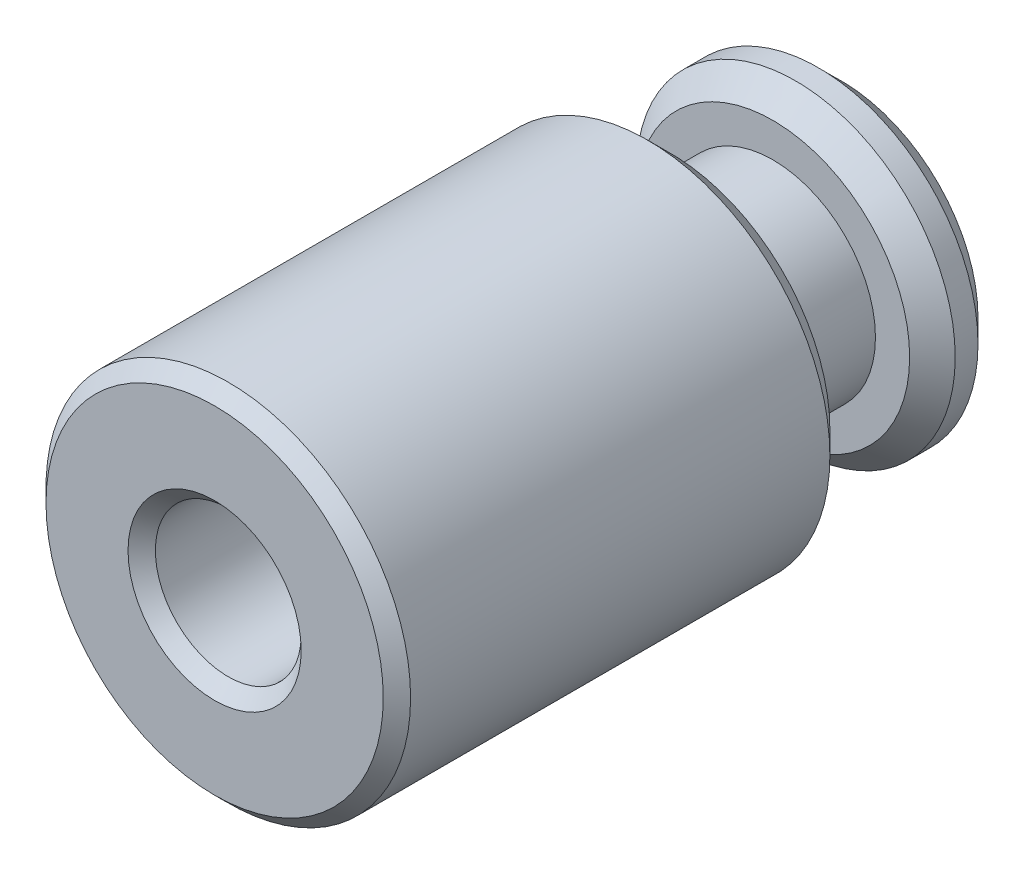
ISO-10303-21;
HEADER;
FILE_DESCRIPTION(('STEP AP214'),'2;1');
FILE_NAME('part.step','',(''),(''),'','','');
FILE_SCHEMA(('AUTOMOTIVE_DESIGN { 1 0 10303 214 1 1 1 1 }'));
ENDSEC;
DATA;
#1=APPLICATION_CONTEXT('core data for automotive mechanical design processes');
#2=APPLICATION_PROTOCOL_DEFINITION('international standard','automotive_design',2000,#1);
#3=PRODUCT_CONTEXT('',#1,'mechanical');
#4=PRODUCT('Part','Part','',(#3));
#5=PRODUCT_RELATED_PRODUCT_CATEGORY('part','',(#4));
#6=PRODUCT_DEFINITION_FORMATION('','',#4);
#7=PRODUCT_DEFINITION_CONTEXT('part definition',#1,'design');
#8=PRODUCT_DEFINITION('design','',#6,#7);
#9=PRODUCT_DEFINITION_SHAPE('','',#8);
#10=(LENGTH_UNIT() NAMED_UNIT(*) SI_UNIT(.MILLI.,.METRE.));
#11=(NAMED_UNIT(*) PLANE_ANGLE_UNIT() SI_UNIT($,.RADIAN.));
#12=(NAMED_UNIT(*) SI_UNIT($,.STERADIAN.) SOLID_ANGLE_UNIT());
#13=UNCERTAINTY_MEASURE_WITH_UNIT(LENGTH_MEASURE(1.E-05),#10,'distance_accuracy_value','');
#14=(GEOMETRIC_REPRESENTATION_CONTEXT(3) GLOBAL_UNCERTAINTY_ASSIGNED_CONTEXT((#13)) GLOBAL_UNIT_ASSIGNED_CONTEXT((#10,
#11,#12)) REPRESENTATION_CONTEXT('',''));
#15=CARTESIAN_POINT('',(0.,0.,0.));
#16=DIRECTION('',(0.,0.,1.));
#17=DIRECTION('',(1.,0.,0.));
#18=AXIS2_PLACEMENT_3D('',#15,#16,#17);
#19=CARTESIAN_POINT('',(-1.192092889E-07,0.0006803143114548,-55.64877051889));
#20=DIRECTION('',(0.,-1.68587396411497E-07,-0.999999999999986));
#21=DIRECTION('',(0.,-0.999999999999986,1.68587396411497E-07));
#22=AXIS2_PLACEMENT_3D('',#19,#20,#21);
#23=PLANE('',#22);
#24=CARTESIAN_POINT('',(-1.192092887E-07,0.0006803143114543,-55.64877051889));
#25=DIRECTION('',(0.,-1.68587396641497E-07,-0.999999999999986));
#26=DIRECTION('',(1.,0.,0.));
#27=AXIS2_PLACEMENT_3D('',#24,#25,#26);
#28=CIRCLE('',#27,3.);
#29=CARTESIAN_POINT('',(2.999999880791,0.0006803143114549,-55.64877051889));
#30=VERTEX_POINT('',#29);
#31=EDGE_CURVE('E10',#30,#30,#28,.T.);
#32=ORIENTED_EDGE('',*,*,#31,.T.);
#33=EDGE_LOOP('',(#32));
#34=FACE_BOUND('',#33,.T.);
#35=ADVANCED_FACE('F15',(#34),#23,.T.);
#36=CARTESIAN_POINT('',(-1.192092887E-07,0.0006803986051527,-55.14877051889));
#37=DIRECTION('',(0.,1.68587396641497E-07,0.999999999999986));
#38=DIRECTION('',(1.,0.,0.));
#39=AXIS2_PLACEMENT_3D('',#36,#37,#38);
#40=CONICAL_SURFACE('',#39,3.5,0.785398163397);
#41=DIRECTION('',(-0.707106781186543,-1.19209291372723E-07,-0.707106781186543));
#42=VECTOR('',#41,1.);
#43=CARTESIAN_POINT('',(3.499999880791,0.0006803986051526,-55.14877051889));
#44=LINE('',#43,#42);
#45=CARTESIAN_POINT('',(3.499999880791,0.0006803986051534,-55.14877051889));
#46=VERTEX_POINT('',#45);
#47=EDGE_CURVE('E24',#46,#30,#44,.T.);
#48=ORIENTED_EDGE('',*,*,#47,.F.);
#49=CARTESIAN_POINT('',(-1.192092887E-07,0.0006803986051527,-55.14877051889));
#50=DIRECTION('',(0.,-1.68587396641497E-07,-0.999999999999986));
#51=DIRECTION('',(1.,0.,0.));
#52=AXIS2_PLACEMENT_3D('',#49,#50,#51);
#53=CIRCLE('',#52,3.5);
#54=EDGE_CURVE('E127',#46,#46,#53,.T.);
#55=ORIENTED_EDGE('',*,*,#54,.T.);
#56=ORIENTED_EDGE('',*,*,#47,.T.);
#57=ORIENTED_EDGE('',*,*,#31,.F.);
#58=EDGE_LOOP('',(#48,#55,#56,#57));
#59=FACE_BOUND('',#58,.T.);
#60=ADVANCED_FACE('F17',(#59),#40,.T.);
#61=CARTESIAN_POINT('',(-1.192092887E-07,0.0006805671925493,-54.14877051889));
#62=DIRECTION('',(0.,1.68587396711497E-07,0.999999999999986));
#63=DIRECTION('',(1.,0.,0.));
#64=AXIS2_PLACEMENT_3D('',#61,#62,#63);
#65=CYLINDRICAL_SURFACE('',#64,3.5);
#66=CARTESIAN_POINT('',(-1.192092887E-07,0.000680482898851,-54.64877051889));
#67=DIRECTION('',(0.,-1.68587396641497E-07,-0.999999999999986));
#68=DIRECTION('',(1.,0.,0.));
#69=AXIS2_PLACEMENT_3D('',#66,#67,#68);
#70=CIRCLE('',#69,3.5);
#71=CARTESIAN_POINT('',(3.499999880791,0.0006804828988518,-54.64877051889));
#72=VERTEX_POINT('',#71);
#73=EDGE_CURVE('E119',#72,#72,#70,.T.);
#74=ORIENTED_EDGE('',*,*,#73,.T.);
#75=DIRECTION('',(0.,-1.68587396711497E-07,-0.999999999999986));
#76=VECTOR('',#75,1.);
#77=CARTESIAN_POINT('',(3.499999880791,0.0006805671925493,-54.14877051889));
#78=LINE('',#77,#76);
#79=EDGE_CURVE('E123',#72,#46,#78,.T.);
#80=ORIENTED_EDGE('',*,*,#79,.T.);
#81=ORIENTED_EDGE('',*,*,#54,.F.);
#82=ORIENTED_EDGE('',*,*,#79,.F.);
#83=EDGE_LOOP('',(#74,#80,#81,#82));
#84=FACE_BOUND('',#83,.T.);
#85=ADVANCED_FACE('F133',(#84),#65,.T.);
#86=CARTESIAN_POINT('',(-1.192092887E-07,0.000680482898851,-54.64877051889));
#87=DIRECTION('',(0.,-1.68587396641497E-07,-0.999999999999986));
#88=DIRECTION('',(1.,0.,0.));
#89=AXIS2_PLACEMENT_3D('',#86,#87,#88);
#90=CONICAL_SURFACE('',#89,3.5,0.785398163397);
#91=DIRECTION('',(0.707106781186543,-1.19209291382723E-07,-0.707106781186543));
#92=VECTOR('',#91,1.);
#93=CARTESIAN_POINT('',(3.499999880791,0.000680482898851,-54.64877051889));
#94=LINE('',#93,#92);
#95=CARTESIAN_POINT('',(2.999999880791,0.0006805671925493,-54.14877051889));
#96=VERTEX_POINT('',#95);
#97=EDGE_CURVE('E118',#96,#72,#94,.T.);
#98=ORIENTED_EDGE('',*,*,#97,.F.);
#99=CARTESIAN_POINT('',(-1.192092887E-07,0.0006805671925493,-54.14877051889));
#100=DIRECTION('',(0.,-1.68587396641497E-07,-0.999999999999986));
#101=DIRECTION('',(1.,0.,0.));
#102=AXIS2_PLACEMENT_3D('',#99,#100,#101);
#103=CIRCLE('',#102,3.);
#104=EDGE_CURVE('E114',#96,#96,#103,.T.);
#105=ORIENTED_EDGE('',*,*,#104,.T.);
#106=ORIENTED_EDGE('',*,*,#97,.T.);
#107=ORIENTED_EDGE('',*,*,#73,.F.);
#108=EDGE_LOOP('',(#98,#105,#106,#107));
#109=FACE_BOUND('',#108,.T.);
#110=ADVANCED_FACE('F137',(#109),#90,.T.);
#111=CARTESIAN_POINT('',(-1.192092889E-07,0.0006805671925496,-54.14877051889));
#112=DIRECTION('',(0.,-1.68587396411497E-07,-0.999999999999986));
#113=DIRECTION('',(0.,-0.999999999999986,1.68587396411497E-07));
#114=AXIS2_PLACEMENT_3D('',#111,#112,#113);
#115=PLANE('',#114);
#116=CARTESIAN_POINT('',(-1.192092887E-07,0.0006805671925497,-54.14877051889));
#117=DIRECTION('',(0.,1.68587396711497E-07,0.999999999999986));
#118=DIRECTION('',(1.,0.,0.));
#119=AXIS2_PLACEMENT_3D('',#116,#117,#118);
#120=CIRCLE('',#119,2.25);
#121=CARTESIAN_POINT('',(2.249999880791,0.0006805671925493,-54.14877051889));
#122=VERTEX_POINT('',#121);
#123=EDGE_CURVE('E111',#122,#122,#120,.T.);
#124=ORIENTED_EDGE('',*,*,#123,.F.);
#125=EDGE_LOOP('',(#124));
#126=FACE_BOUND('',#125,.T.);
#127=ORIENTED_EDGE('',*,*,#104,.F.);
#128=EDGE_LOOP('',(#127));
#129=FACE_BOUND('',#128,.T.);
#130=ADVANCED_FACE('F226',(#126,#129),#115,.F.);
#131=CARTESIAN_POINT('',(-1.192092887E-07,0.0006809465141924,-51.89877051889));
#132=DIRECTION('',(0.,1.68587397151498E-07,0.999999999999986));
#133=DIRECTION('',(1.,0.,0.));
#134=AXIS2_PLACEMENT_3D('',#131,#132,#133);
#135=CYLINDRICAL_SURFACE('',#134,2.25);
#136=DIRECTION('',(0.,-1.68587397151498E-07,-0.999999999999986));
#137=VECTOR('',#136,1.);
#138=CARTESIAN_POINT('',(2.249999880791,0.0006809465141924,-51.89877051889));
#139=LINE('',#138,#137);
#140=CARTESIAN_POINT('',(2.249999880791,0.0006809465141924,-51.89877051889));
#141=VERTEX_POINT('',#140);
#142=EDGE_CURVE('E105',#141,#122,#139,.T.);
#143=ORIENTED_EDGE('',*,*,#142,.T.);
#144=ORIENTED_EDGE('',*,*,#123,.T.);
#145=ORIENTED_EDGE('',*,*,#142,.F.);
#146=CARTESIAN_POINT('',(-1.192092887E-07,0.0006809465141924,-51.89877051889));
#147=DIRECTION('',(0.,1.68587396711497E-07,0.999999999999986));
#148=DIRECTION('',(1.,0.,0.));
#149=AXIS2_PLACEMENT_3D('',#146,#147,#148);
#150=CIRCLE('',#149,2.25);
#151=EDGE_CURVE('E99',#141,#141,#150,.T.);
#152=ORIENTED_EDGE('',*,*,#151,.F.);
#153=EDGE_LOOP('',(#143,#144,#145,#152));
#154=FACE_BOUND('',#153,.T.);
#155=ADVANCED_FACE('F233',(#154),#135,.T.);
#156=CARTESIAN_POINT('',(-1.1920928896E-07,0.0006809465141927,-51.89877051889));
#157=DIRECTION('',(0.,-1.68587396711497E-07,-0.999999999999986));
#158=DIRECTION('',(0.,-0.999999999999986,1.68587396711497E-07));
#159=AXIS2_PLACEMENT_3D('',#156,#157,#158);
#160=PLANE('',#159);
#161=ORIENTED_EDGE('',*,*,#151,.T.);
#162=EDGE_LOOP('',(#161));
#163=FACE_BOUND('',#162,.T.);
#164=CARTESIAN_POINT('',(-1.192092887E-07,0.0006809465141924,-51.89877051889));
#165=DIRECTION('',(0.,1.68587396931497E-07,0.999999999999986));
#166=DIRECTION('',(1.,0.,0.));
#167=AXIS2_PLACEMENT_3D('',#164,#165,#166);
#168=CIRCLE('',#167,3.5);
#169=CARTESIAN_POINT('',(3.499999880791,0.0006809465141924,-51.89877051889));
#170=VERTEX_POINT('',#169);
#171=EDGE_CURVE('E94',#170,#170,#168,.T.);
#172=ORIENTED_EDGE('',*,*,#171,.F.);
#173=EDGE_LOOP('',(#172));
#174=FACE_BOUND('',#173,.T.);
#175=ADVANCED_FACE('F298',(#163,#174),#160,.T.);
#176=CARTESIAN_POINT('',(-1.192092887E-07,0.0006810308078909,-51.39877051889));
#177=DIRECTION('',(0.,1.68587396931497E-07,0.999999999999986));
#178=DIRECTION('',(1.,0.,0.));
#179=AXIS2_PLACEMENT_3D('',#176,#177,#178);
#180=CONICAL_SURFACE('',#179,4.,0.785398163397);
#181=ORIENTED_EDGE('',*,*,#171,.T.);
#182=DIRECTION('',(-0.707106781186543,-1.19209291592723E-07,-0.707106781186543));
#183=VECTOR('',#182,1.);
#184=CARTESIAN_POINT('',(3.999999880791,0.0006810308078909,-51.39877051889));
#185=LINE('',#184,#183);
#186=CARTESIAN_POINT('',(3.999999880791,0.0006810308078909,-51.39877051889));
#187=VERTEX_POINT('',#186);
#188=EDGE_CURVE('E91',#187,#170,#185,.T.);
#189=ORIENTED_EDGE('',*,*,#188,.F.);
#190=CARTESIAN_POINT('',(-1.192092887E-07,0.0006810308078909,-51.39877051889));
#191=DIRECTION('',(0.,1.68587396931497E-07,0.999999999999986));
#192=DIRECTION('',(1.,0.,0.));
#193=AXIS2_PLACEMENT_3D('',#190,#191,#192);
#194=CIRCLE('',#193,4.);
#195=EDGE_CURVE('E96',#187,#187,#194,.T.);
#196=ORIENTED_EDGE('',*,*,#195,.F.);
#197=ORIENTED_EDGE('',*,*,#188,.T.);
#198=EDGE_LOOP('',(#181,#189,#196,#197));
#199=FACE_BOUND('',#198,.T.);
#200=ADVANCED_FACE('F92',(#199),#180,.T.);
#201=CARTESIAN_POINT('',(-1.192092887E-07,0.0006809465141924,-51.89877051889));
#202=DIRECTION('',(0.,-1.68587397151498E-07,-0.999999999999986));
#203=DIRECTION('',(1.,0.,0.));
#204=AXIS2_PLACEMENT_3D('',#201,#202,#203);
#205=CYLINDRICAL_SURFACE('',#204,4.);
#206=ORIENTED_EDGE('',*,*,#195,.T.);
#207=DIRECTION('',(0.,1.68587397151498E-07,0.999999999999986));
#208=VECTOR('',#207,1.);
#209=CARTESIAN_POINT('',(3.999999880791,0.0006809465141924,-51.89877051889));
#210=LINE('',#209,#208);
#211=CARTESIAN_POINT('',(3.999999880791,0.0006825818119426,-42.19877051889));
#212=VERTEX_POINT('',#211);
#213=EDGE_CURVE('E107',#187,#212,#210,.T.);
#214=ORIENTED_EDGE('',*,*,#213,.T.);
#215=CARTESIAN_POINT('',(-1.192092887E-07,0.0006825818119426,-42.19877051889));
#216=DIRECTION('',(0.,1.68587396931497E-07,0.999999999999986));
#217=DIRECTION('',(1.,0.,0.));
#218=AXIS2_PLACEMENT_3D('',#215,#216,#217);
#219=CIRCLE('',#218,4.);
#220=EDGE_CURVE('E148',#212,#212,#219,.T.);
#221=ORIENTED_EDGE('',*,*,#220,.F.);
#222=ORIENTED_EDGE('',*,*,#213,.F.);
#223=EDGE_LOOP('',(#206,#214,#221,#222));
#224=FACE_BOUND('',#223,.T.);
#225=ADVANCED_FACE('F211',(#224),#205,.T.);
#226=CARTESIAN_POINT('',(-1.192092887E-07,0.0006825818119426,-42.19877051889));
#227=DIRECTION('',(0.,-1.68587396931497E-07,-0.999999999999986));
#228=DIRECTION('',(1.,0.,0.));
#229=AXIS2_PLACEMENT_3D('',#226,#227,#228);
#230=CONICAL_SURFACE('',#229,4.,0.785398163397);
#231=DIRECTION('',(-0.707106781186543,1.19209291212723E-07,0.707106781186543));
#232=VECTOR('',#231,1.);
#233=CARTESIAN_POINT('',(3.999999880791,0.0006825818119448,-42.19877051889));
#234=LINE('',#233,#232);
#235=CARTESIAN_POINT('',(3.699999880791,0.0006826323881617,-41.89877051889));
#236=VERTEX_POINT('',#235);
#237=EDGE_CURVE('E151',#212,#236,#234,.T.);
#238=ORIENTED_EDGE('',*,*,#237,.F.);
#239=ORIENTED_EDGE('',*,*,#220,.T.);
#240=ORIENTED_EDGE('',*,*,#237,.T.);
#241=CARTESIAN_POINT('',(-1.192092887E-07,0.0006826323881617,-41.89877051889));
#242=DIRECTION('',(0.,1.68587396931497E-07,0.999999999999986));
#243=DIRECTION('',(1.,0.,0.));
#244=AXIS2_PLACEMENT_3D('',#241,#242,#243);
#245=CIRCLE('',#244,3.7);
#246=EDGE_CURVE('E159',#236,#236,#245,.T.);
#247=ORIENTED_EDGE('',*,*,#246,.F.);
#248=EDGE_LOOP('',(#238,#239,#240,#247));
#249=FACE_BOUND('',#248,.T.);
#250=ADVANCED_FACE('F208',(#249),#230,.T.);
#251=CARTESIAN_POINT('',(-1.1920928896E-07,0.0006826323881617,-41.89877051889));
#252=DIRECTION('',(0.,-1.68587396711497E-07,-0.999999999999986));
#253=DIRECTION('',(0.,-0.999999999999986,1.68587396711497E-07));
#254=AXIS2_PLACEMENT_3D('',#251,#252,#253);
#255=PLANE('',#254);
#256=CARTESIAN_POINT('',(-1.192092887E-07,0.0006826323881617,-41.89877051889));
#257=DIRECTION('',(0.,1.68587396931497E-07,0.999999999999986));
#258=DIRECTION('',(1.,0.,0.));
#259=AXIS2_PLACEMENT_3D('',#256,#257,#258);
#260=CIRCLE('',#259,1.9);
#261=CARTESIAN_POINT('',(1.899999880791,0.0006826323881597,-41.89877051889));
#262=VERTEX_POINT('',#261);
#263=EDGE_CURVE('E146',#262,#262,#260,.T.);
#264=ORIENTED_EDGE('',*,*,#263,.F.);
#265=EDGE_LOOP('',(#264));
#266=FACE_BOUND('',#265,.T.);
#267=ORIENTED_EDGE('',*,*,#246,.T.);
#268=EDGE_LOOP('',(#267));
#269=FACE_BOUND('',#268,.T.);
#270=ADVANCED_FACE('F204',(#266,#269),#255,.F.);
#271=CARTESIAN_POINT('',(-1.1920928881E-07,0.0006812836889845,-49.89877051889));
#272=DIRECTION('',(0.,-1.68587396711497E-07,-0.999999999999986));
#273=DIRECTION('',(0.,-0.999999999999986,1.68587396711497E-07));
#274=AXIS2_PLACEMENT_3D('',#271,#272,#273);
#275=PLANE('',#274);
#276=CARTESIAN_POINT('',(-1.192092887E-07,0.0006812836889863,-49.89877051889));
#277=DIRECTION('',(0.,1.68587396931497E-07,0.999999999999986));
#278=DIRECTION('',(1.,0.,0.));
#279=AXIS2_PLACEMENT_3D('',#276,#277,#278);
#280=CIRCLE('',#279,1.2);
#281=CARTESIAN_POINT('',(1.199999880791,0.0006812836889843,-49.89877051889));
#282=VERTEX_POINT('',#281);
#283=EDGE_CURVE('E168',#282,#282,#280,.T.);
#284=ORIENTED_EDGE('',*,*,#283,.T.);
#285=EDGE_LOOP('',(#284));
#286=FACE_BOUND('',#285,.T.);
#287=ADVANCED_FACE('F207',(#286),#275,.F.);
#288=CARTESIAN_POINT('',(-1.192092887E-07,0.0006825818119426,-42.19877051889));
#289=DIRECTION('',(0.,1.68587396931497E-07,0.999999999999986));
#290=DIRECTION('',(1.,0.,0.));
#291=AXIS2_PLACEMENT_3D('',#288,#289,#290);
#292=CONICAL_SURFACE('',#291,1.6,0.785398163397);
#293=DIRECTION('',(-0.707106781186543,-1.19209291562723E-07,-0.707106781186543));
#294=VECTOR('',#293,1.);
#295=CARTESIAN_POINT('',(1.599999880791,0.0006825818119426,-42.19877051889));
#296=LINE('',#295,#294);
#297=CARTESIAN_POINT('',(1.599999880791,0.0006825818119406,-42.19877051889));
#298=VERTEX_POINT('',#297);
#299=EDGE_CURVE('E167',#262,#298,#296,.T.);
#300=ORIENTED_EDGE('',*,*,#299,.F.);
#301=ORIENTED_EDGE('',*,*,#263,.T.);
#302=ORIENTED_EDGE('',*,*,#299,.T.);
#303=CARTESIAN_POINT('',(-1.192092887E-07,0.0006825818119426,-42.19877051889));
#304=DIRECTION('',(0.,1.68587396931497E-07,0.999999999999986));
#305=DIRECTION('',(1.,0.,0.));
#306=AXIS2_PLACEMENT_3D('',#303,#304,#305);
#307=CIRCLE('',#306,1.6);
#308=EDGE_CURVE('E187',#298,#298,#307,.T.);
#309=ORIENTED_EDGE('',*,*,#308,.F.);
#310=EDGE_LOOP('',(#300,#301,#302,#309));
#311=FACE_BOUND('',#310,.T.);
#312=ADVANCED_FACE('F198',(#311),#292,.F.);
#313=CARTESIAN_POINT('',(-1.192092887E-07,0.000681351123945,-49.49877051889));
#314=DIRECTION('',(0.,1.68587396931497E-07,0.999999999999986));
#315=DIRECTION('',(1.,0.,0.));
#316=AXIS2_PLACEMENT_3D('',#313,#314,#315);
#317=CONICAL_SURFACE('',#316,1.6,0.785398163397);
#318=DIRECTION('',(-0.707106781186543,-1.19209290802723E-07,-0.707106781186543));
#319=VECTOR('',#318,1.);
#320=CARTESIAN_POINT('',(1.599999880791,0.0006813511239433,-49.49877051889));
#321=LINE('',#320,#319);
#322=CARTESIAN_POINT('',(1.599999880791,0.000681351123943,-49.49877051889));
#323=VERTEX_POINT('',#322);
#324=EDGE_CURVE('E172',#323,#282,#321,.T.);
#325=ORIENTED_EDGE('',*,*,#324,.F.);
#326=CARTESIAN_POINT('',(-1.192092887E-07,0.000681351123945,-49.49877051889));
#327=DIRECTION('',(0.,1.68587396931497E-07,0.999999999999986));
#328=DIRECTION('',(1.,0.,0.));
#329=AXIS2_PLACEMENT_3D('',#326,#327,#328);
#330=CIRCLE('',#329,1.6);
#331=EDGE_CURVE('E176',#323,#323,#330,.T.);
#332=ORIENTED_EDGE('',*,*,#331,.T.);
#333=ORIENTED_EDGE('',*,*,#324,.T.);
#334=ORIENTED_EDGE('',*,*,#283,.F.);
#335=EDGE_LOOP('',(#325,#332,#333,#334));
#336=FACE_BOUND('',#335,.T.);
#337=ADVANCED_FACE('F241',(#336),#317,.F.);
#338=CARTESIAN_POINT('',(-1.192092887E-07,0.0006826323881617,-41.89877051889));
#339=DIRECTION('',(0.,1.68587397151498E-07,0.999999999999986));
#340=DIRECTION('',(1.,0.,0.));
#341=AXIS2_PLACEMENT_3D('',#338,#339,#340);
#342=CYLINDRICAL_SURFACE('',#341,1.6);
#343=ORIENTED_EDGE('',*,*,#308,.T.);
#344=DIRECTION('',(0.,-1.68587397151498E-07,-0.999999999999986));
#345=VECTOR('',#344,1.);
#346=CARTESIAN_POINT('',(1.599999880791,0.0006826323881617,-41.89877051889));
#347=LINE('',#346,#345);
#348=EDGE_CURVE('E180',#298,#323,#347,.T.);
#349=ORIENTED_EDGE('',*,*,#348,.T.);
#350=ORIENTED_EDGE('',*,*,#331,.F.);
#351=ORIENTED_EDGE('',*,*,#348,.F.);
#352=EDGE_LOOP('',(#343,#349,#350,#351));
#353=FACE_BOUND('',#352,.T.);
#354=ADVANCED_FACE('F194',(#353),#342,.F.);
#355=CLOSED_SHELL('',(#35,#60,#85,#110,#130,#155,#175,#200,#225,#250,#270,#287,#312,#337,#354));
#356=MANIFOLD_SOLID_BREP('B1',#355);
#357=ADVANCED_BREP_SHAPE_REPRESENTATION('',(#18,#356),#14);
#358=SHAPE_DEFINITION_REPRESENTATION(#9,#357);
ENDSEC;
END-ISO-10303-21;
